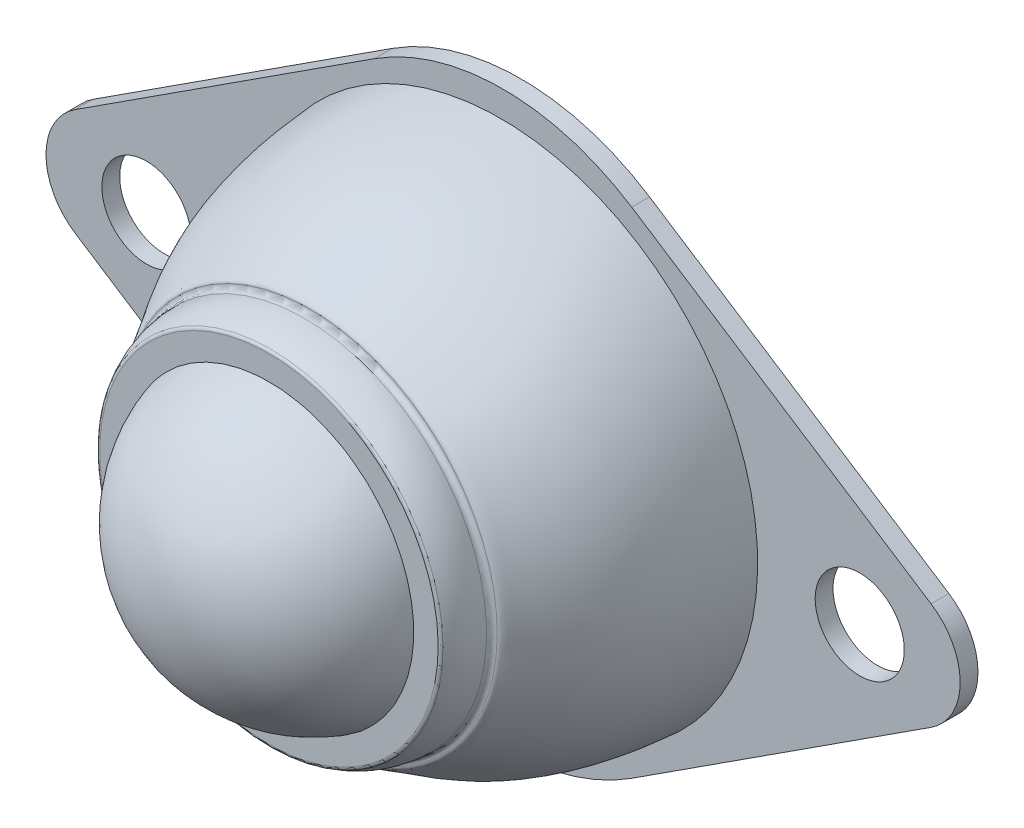
ISO-10303-21;
HEADER;
FILE_DESCRIPTION(('STEP AP214'),'2;1');
FILE_NAME('part.step','',(''),(''),'','','');
FILE_SCHEMA(('AUTOMOTIVE_DESIGN { 1 0 10303 214 1 1 1 1 }'));
ENDSEC;
DATA;
#1=APPLICATION_CONTEXT('core data for automotive mechanical design processes');
#2=APPLICATION_PROTOCOL_DEFINITION('international standard','automotive_design',2000,#1);
#3=PRODUCT_CONTEXT('',#1,'mechanical');
#4=PRODUCT('Part','Part','',(#3));
#5=PRODUCT_RELATED_PRODUCT_CATEGORY('part','',(#4));
#6=PRODUCT_DEFINITION_FORMATION('','',#4);
#7=PRODUCT_DEFINITION_CONTEXT('part definition',#1,'design');
#8=PRODUCT_DEFINITION('design','',#6,#7);
#9=PRODUCT_DEFINITION_SHAPE('','',#8);
#10=(LENGTH_UNIT() NAMED_UNIT(*) SI_UNIT(.MILLI.,.METRE.));
#11=(NAMED_UNIT(*) PLANE_ANGLE_UNIT() SI_UNIT($,.RADIAN.));
#12=(NAMED_UNIT(*) SI_UNIT($,.STERADIAN.) SOLID_ANGLE_UNIT());
#13=UNCERTAINTY_MEASURE_WITH_UNIT(LENGTH_MEASURE(1.E-05),#10,'distance_accuracy_value','');
#14=(GEOMETRIC_REPRESENTATION_CONTEXT(3) GLOBAL_UNCERTAINTY_ASSIGNED_CONTEXT((#13)) GLOBAL_UNIT_ASSIGNED_CONTEXT((#10,
#11,#12)) REPRESENTATION_CONTEXT('',''));
#15=CARTESIAN_POINT('',(0.,0.,0.));
#16=DIRECTION('',(0.,0.,1.));
#17=DIRECTION('',(1.,0.,0.));
#18=AXIS2_PLACEMENT_3D('',#15,#16,#17);
#19=CARTESIAN_POINT('',(15.2377372021562,-7.43146212809468,48.9631578947368));
#20=CARTESIAN_POINT('',(15.2377334064931,-7.43146046419454,60.0776508734915));
#21=CARTESIAN_POINT('',(11.9608409389113,-5.99497316377451,60.077650900424));
#22=CARTESIAN_POINT('',(12.1088145151502,-6.059840157479,62.4631578947368));
#23=CARTESIAN_POINT('',(11.574277558577,-5.82551585257153,62.4631578947368));
#24=B_SPLINE_CURVE_WITH_KNOTS('',4,(#19,#20,#21,#22,#23),.UNSPECIFIED.,.F.,.F.,(5,5),(0.,1.),.UNSPECIFIED.);
#25=CARTESIAN_POINT('',(1.95769599418163,-1.60990687932326,74.9542750035906));
#26=DIRECTION('',(0.,0.,1.));
#27=AXIS1_PLACEMENT('',#25,#26);
#28=SURFACE_OF_REVOLUTION('',#24,#27);
#29=CARTESIAN_POINT('',(1.95769599418163,-1.60990687932326,62.4631578947368));
#30=DIRECTION('',(0.,0.,1.));
#31=DIRECTION('',(-0.915864910894796,0.401486568880788,0.));
#32=AXIS2_PLACEMENT_3D('',#29,#30,#31);
#33=CIRCLE('',#32,10.5);
#34=CARTESIAN_POINT('',(-7.65888557021372,2.60570209392502,62.4631578947368));
#35=VERTEX_POINT('',#34);
#36=EDGE_CURVE('P0_E37',#35,#35,#33,.T.);
#37=ORIENTED_EDGE('',*,*,#36,.F.);
#38=EDGE_LOOP('',(#37));
#39=FACE_BOUND('',#38,.T.);
#40=CARTESIAN_POINT('',(1.95769599418163,-1.60990687932326,51.7631578947369));
#41=DIRECTION('',(0.,0.,1.));
#42=DIRECTION('',(-0.915864910894796,0.401486568880788,0.));
#43=AXIS2_PLACEMENT_3D('',#40,#41,#42);
#44=CIRCLE('',#43,14.4048077186134);
#45=CARTESIAN_POINT('',(-11.2351619434829,4.17342994701034,51.7631578947369));
#46=VERTEX_POINT('',#45);
#47=EDGE_CURVE('P0_E108',#46,#46,#44,.F.);
#48=ORIENTED_EDGE('',*,*,#47,.F.);
#49=EDGE_LOOP('',(#48));
#50=FACE_BOUND('',#49,.T.);
#51=ADVANCED_FACE('P0_F14',(#39,#50),#28,.T.);
#52=CARTESIAN_POINT('',(15.2377372021562,-7.43146212809468,48.9631578947368));
#53=CARTESIAN_POINT('',(15.2377338872716,-7.43146067495281,58.6698312143077));
#54=CARTESIAN_POINT('',(12.7384028720801,-6.335832027267,59.8993291121425));
#55=CARTESIAN_POINT('',(12.2038121606893,-6.10148415792657,61.644060330571));
#56=CARTESIAN_POINT('',(11.8100110798226,-5.92885406488781,62.2675982846212));
#57=B_SPLINE_CURVE_WITH_KNOTS('',4,(#52,#53,#54,#55,#56),.UNSPECIFIED.,.F.,.F.,(5,5),(0.,
0.873334783523202),.UNSPECIFIED.);
#58=CARTESIAN_POINT('',(1.95769599418163,-1.60990687932326,74.9542750035906));
#59=DIRECTION('',(0.,0.,1.));
#60=AXIS1_PLACEMENT('',#58,#59);
#61=SURFACE_OF_REVOLUTION('',#57,#60);
#62=OFFSET_SURFACE('',#61,-1.5,.F.);
#63=CARTESIAN_POINT('',(1.95769599418163,-1.60990687932326,61.1659081283625));
#64=DIRECTION('',(0.,0.,1.));
#65=DIRECTION('',(-0.915864910894796,0.401486568880788,0.));
#66=AXIS2_PLACEMENT_3D('',#63,#64,#65);
#67=CIRCLE('',#66,9.6700643495926);
#68=CARTESIAN_POINT('',(-6.89877662970494,2.27249407725111,61.1659081283625));
#69=VERTEX_POINT('',#68);
#70=EDGE_CURVE('P0_E40',#69,#69,#67,.T.);
#71=ORIENTED_EDGE('',*,*,#70,.T.);
#72=EDGE_LOOP('',(#71));
#73=FACE_BOUND('',#72,.T.);
#74=CARTESIAN_POINT('',(1.95769599418163,-1.60990687932326,51.7631578947368));
#75=DIRECTION('',(0.,0.,1.));
#76=DIRECTION('',(-0.915864910894796,0.401486568880788,0.));
#77=AXIS2_PLACEMENT_3D('',#74,#75,#76);
#78=CIRCLE('',#77,12.9007266368042);
#79=CARTESIAN_POINT('',(-9.85762685751318,3.56956159415626,51.7631578947368));
#80=VERTEX_POINT('',#79);
#81=EDGE_CURVE('P0_E18',#80,#80,#78,.F.);
#82=ORIENTED_EDGE('',*,*,#81,.T.);
#83=EDGE_LOOP('',(#82));
#84=FACE_BOUND('',#83,.T.);
#85=ADVANCED_FACE('P0_F55',(#73,#84),#62,.F.);
#86=CARTESIAN_POINT('',(10.7499991387717,-5.46417794057882,64.7631578947368));
#87=DIRECTION('',(0.,0.,-1.));
#88=DIRECTION('',(0.915864910894796,-0.401486568880788,0.));
#89=AXIS2_PLACEMENT_3D('',#86,#87,#88);
#90=PLANE('',#89);
#91=CARTESIAN_POINT('',(1.95769599418163,-1.60990687932326,64.7631578947368));
#92=DIRECTION('',(0.,0.,-1.));
#93=DIRECTION('',(0.915864910894796,-0.401486568880788,0.));
#94=AXIS2_PLACEMENT_3D('',#91,#92,#93);
#95=CIRCLE('',#94,8.05140383008776);
#96=CARTESIAN_POINT('',(9.33169424560297,-4.84243737773882,64.7631578947368));
#97=VERTEX_POINT('',#96);
#98=EDGE_CURVE('P0_E10',#97,#97,#95,.T.);
#99=ORIENTED_EDGE('',*,*,#98,.T.);
#100=EDGE_LOOP('',(#99));
#101=FACE_BOUND('',#100,.T.);
#102=CARTESIAN_POINT('',(1.95769599418163,-1.60990687932326,64.7631578947368));
#103=DIRECTION('',(0.,0.,-1.));
#104=DIRECTION('',(0.915864910894796,-0.401486568880788,0.));
#105=AXIS2_PLACEMENT_3D('',#102,#103,#104);
#106=CIRCLE('',#105,9.49032495343307);
#107=CARTESIAN_POINT('',(10.6495516120203,-5.42014488244082,64.7631578947368));
#108=VERTEX_POINT('',#107);
#109=EDGE_CURVE('P0_E31',#108,#108,#106,.F.);
#110=ORIENTED_EDGE('',*,*,#109,.T.);
#111=EDGE_LOOP('',(#110));
#112=FACE_BOUND('',#111,.T.);
#113=ADVANCED_FACE('P0_F57',(#101,#112),#90,.F.);
#114=CARTESIAN_POINT('',(1.95769599418163,-1.60990687932326,62.7631578947372));
#115=DIRECTION('',(0.,0.,1.));
#116=DIRECTION('',(-0.915864910894796,0.401486568880788,0.));
#117=AXIS2_PLACEMENT_3D('',#114,#115,#116);
#118=TOROIDAL_SURFACE('',#117,6.56666666666786,3.63333333333214);
#119=CARTESIAN_POINT('',(1.95769599418163,-1.60990687932326,64.6680122636689));
#120=DIRECTION('',(0.,0.,-1.));
#121=DIRECTION('',(0.915864910894796,-0.401486568880788,0.));
#122=AXIS2_PLACEMENT_3D('',#119,#120,#121);
#123=CIRCLE('',#122,9.66063514489517);
#124=CARTESIAN_POINT('',(10.8055327403482,-5.48852213685637,64.6680122636689));
#125=VERTEX_POINT('',#124);
#126=EDGE_CURVE('P0_E26',#125,#125,#123,.T.);
#127=ORIENTED_EDGE('',*,*,#126,.T.);
#128=EDGE_LOOP('',(#127));
#129=FACE_BOUND('',#128,.T.);
#130=CARTESIAN_POINT('',(1.95769599418163,-1.60990687932326,62.7631578947368));
#131=DIRECTION('',(0.,0.,1.));
#132=DIRECTION('',(-0.915864910894796,0.401486568880788,0.));
#133=AXIS2_PLACEMENT_3D('',#130,#131,#132);
#134=CIRCLE('',#133,10.2);
#135=CARTESIAN_POINT('',(-7.38412609694529,2.48525612326078,62.7631578947368));
#136=VERTEX_POINT('',#135);
#137=EDGE_CURVE('P0_E34',#136,#136,#134,.T.);
#138=ORIENTED_EDGE('',*,*,#137,.T.);
#139=EDGE_LOOP('',(#138));
#140=FACE_BOUND('',#139,.T.);
#141=ADVANCED_FACE('P0_F78',(#129,#140),#118,.T.);
#142=CARTESIAN_POINT('',(1.95769599418163,-1.60990687932326,62.7631578947368));
#143=DIRECTION('',(0.,0.,1.));
#144=DIRECTION('',(-0.915864910894796,0.401486568880788,0.));
#145=AXIS2_PLACEMENT_3D('',#142,#143,#144);
#146=TOROIDAL_SURFACE('',#145,10.5,0.300000000000003);
#147=ORIENTED_EDGE('',*,*,#137,.F.);
#148=EDGE_LOOP('',(#147));
#149=FACE_BOUND('',#148,.T.);
#150=ORIENTED_EDGE('',*,*,#36,.T.);
#151=EDGE_LOOP('',(#150));
#152=FACE_BOUND('',#151,.T.);
#153=ADVANCED_FACE('P0_F83',(#149,#152),#146,.F.);
#154=CARTESIAN_POINT('',(1.95769599418163,-1.60990687932326,62.7631578947372));
#155=DIRECTION('',(0.,0.,1.));
#156=DIRECTION('',(-0.915864910894796,0.401486568880788,0.));
#157=AXIS2_PLACEMENT_3D('',#154,#155,#156);
#158=TOROIDAL_SURFACE('',#157,6.56666666666786,2.13333333333214);
#159=CARTESIAN_POINT('',(1.95769599418163,-1.60990687932326,64.4088721804511));
#160=DIRECTION('',(0.,0.,-1.));
#161=DIRECTION('',(0.915864910894796,-0.401486568880788,0.));
#162=AXIS2_PLACEMENT_3D('',#159,#160,#161);
#163=CIRCLE('',#162,7.92414064465171);
#164=CARTESIAN_POINT('',(9.2151383596134,-4.79134291807326,64.4088721804511));
#165=VERTEX_POINT('',#164);
#166=EDGE_CURVE('P0_E22',#165,#165,#163,.F.);
#167=ORIENTED_EDGE('',*,*,#166,.T.);
#168=EDGE_LOOP('',(#167));
#169=FACE_BOUND('',#168,.T.);
#170=CARTESIAN_POINT('',(1.95769599418163,-1.60990687932326,62.763157894737));
#171=DIRECTION('',(0.,0.,1.));
#172=DIRECTION('',(-0.915864910894796,0.401486568880788,0.));
#173=AXIS2_PLACEMENT_3D('',#170,#171,#172);
#174=CIRCLE('',#173,8.7);
#175=CARTESIAN_POINT('',(-6.01032873060309,1.8830262699396,62.763157894737));
#176=VERTEX_POINT('',#175);
#177=EDGE_CURVE('P0_E110',#176,#176,#174,.T.);
#178=ORIENTED_EDGE('',*,*,#177,.F.);
#179=EDGE_LOOP('',(#178));
#180=FACE_BOUND('',#179,.T.);
#181=ADVANCED_FACE('P0_F70',(#169,#180),#158,.F.);
#182=CARTESIAN_POINT('',(1.95769599418163,-1.60990687932326,62.7631578947368));
#183=DIRECTION('',(0.,0.,1.));
#184=DIRECTION('',(-0.915864910894796,0.401486568880788,0.));
#185=AXIS2_PLACEMENT_3D('',#182,#183,#184);
#186=TOROIDAL_SURFACE('',#185,10.5,1.8);
#187=ORIENTED_EDGE('',*,*,#177,.T.);
#188=EDGE_LOOP('',(#187));
#189=FACE_BOUND('',#188,.T.);
#190=ORIENTED_EDGE('',*,*,#70,.F.);
#191=EDGE_LOOP('',(#190));
#192=FACE_BOUND('',#191,.T.);
#193=ADVANCED_FACE('P0_F61',(#189,#192),#186,.T.);
#194=CARTESIAN_POINT('',(1.95769599418163,-1.60990687932326,64.5631578947368));
#195=DIRECTION('',(0.,0.,-1.));
#196=DIRECTION('',(0.915864910894796,-0.401486568880788,0.));
#197=AXIS2_PLACEMENT_3D('',#194,#195,#196);
#198=TOROIDAL_SURFACE('',#197,9.49032495343307,0.2);
#199=ORIENTED_EDGE('',*,*,#126,.F.);
#200=EDGE_LOOP('',(#199));
#201=FACE_BOUND('',#200,.T.);
#202=ORIENTED_EDGE('',*,*,#109,.F.);
#203=EDGE_LOOP('',(#202));
#204=FACE_BOUND('',#203,.T.);
#205=ADVANCED_FACE('P0_F59',(#201,#204),#198,.T.);
#206=CARTESIAN_POINT('',(1.95769599418163,-1.60990687932326,64.5631578947368));
#207=DIRECTION('',(0.,0.,-1.));
#208=DIRECTION('',(0.915864910894796,-0.401486568880788,0.));
#209=AXIS2_PLACEMENT_3D('',#206,#207,#208);
#210=TOROIDAL_SURFACE('',#209,8.05140383008776,0.2);
#211=ORIENTED_EDGE('',*,*,#98,.F.);
#212=EDGE_LOOP('',(#211));
#213=FACE_BOUND('',#212,.T.);
#214=ORIENTED_EDGE('',*,*,#166,.F.);
#215=EDGE_LOOP('',(#214));
#216=FACE_BOUND('',#215,.T.);
#217=ADVANCED_FACE('P0_F16',(#213,#216),#210,.T.);
#218=CARTESIAN_POINT('',(1.95769599418163,-1.60990687932326,51.7631578947368));
#219=DIRECTION('',(0.,0.,-1.));
#220=DIRECTION('',(0.915864910894796,-0.401486568880788,0.));
#221=AXIS2_PLACEMENT_3D('',#218,#219,#220);
#222=PLANE('',#221);
#223=ORIENTED_EDGE('',*,*,#81,.F.);
#224=EDGE_LOOP('',(#223));
#225=FACE_BOUND('',#224,.T.);
#226=ORIENTED_EDGE('',*,*,#47,.T.);
#227=EDGE_LOOP('',(#226));
#228=FACE_BOUND('',#227,.T.);
#229=ADVANCED_FACE('P0_F68',(#225,#228),#222,.T.);
#230=CLOSED_SHELL('',(#51,#85,#113,#141,#153,#181,#193,#205,#217,#229));
#231=MANIFOLD_SOLID_BREP('P0_B1',#230);
#232=CARTESIAN_POINT('',(1.95769599418163,-1.60990687932326,62.2631578947368));
#233=DIRECTION('',(-0.401486568880788,-0.915864910894796,0.));
#234=DIRECTION('',(-0.915864910894796,0.401486568880788,0.));
#235=AXIS2_PLACEMENT_3D('',#232,#233,#234);
#236=SPHERICAL_SURFACE('',#235,8.5);
#237=CARTESIAN_POINT('',(-1.45493984130507,-9.39475862192902,62.2631578947368));
#238=VERTEX_POINT('',#237);
#239=VERTEX_LOOP('',#238);
#240=FACE_BOUND('',#239,.T.);
#241=ADVANCED_FACE('P1_F12',(#240),#236,.T.);
#242=CLOSED_SHELL('',(#241));
#243=MANIFOLD_SOLID_BREP('P1_B1',#242);
#244=CARTESIAN_POINT('',(-19.9720744112589,-1.71023344796259,51.7631578947368));
#245=DIRECTION('',(0.,0.,1.));
#246=DIRECTION('',(1.,0.,0.));
#247=AXIS2_PLACEMENT_3D('',#244,#245,#246);
#248=PLANE('',#247);
#249=CARTESIAN_POINT('',(-17.9143494537037,-1.71023344796259,51.7631578947368));
#250=DIRECTION('',(0.,0.,1.));
#251=DIRECTION('',(1.,0.,0.));
#252=AXIS2_PLACEMENT_3D('',#249,#250,#251);
#253=CIRCLE('',#252,2.5);
#254=CARTESIAN_POINT('',(-15.4143494537037,-1.71023344796259,51.7631578947368));
#255=VERTEX_POINT('',#254);
#256=EDGE_CURVE('P2_E117',#255,#255,#253,.T.);
#257=ORIENTED_EDGE('',*,*,#256,.F.);
#258=EDGE_LOOP('',(#257));
#259=FACE_BOUND('',#258,.T.);
#260=CARTESIAN_POINT('',(-19.9720744112589,-1.71023344796259,51.7631578947368));
#261=DIRECTION('',(0.,0.,1.));
#262=DIRECTION('',(1.,0.,0.));
#263=AXIS2_PLACEMENT_3D('',#260,#261,#262);
#264=CIRCLE('',#263,3.57385398981324);
#265=CARTESIAN_POINT('',(-21.9143494537037,1.28976655203741,51.7631578947368));
#266=VERTEX_POINT('',#265);
#267=CARTESIAN_POINT('',(-21.9143494537037,-4.71023344796259,51.7631578947368));
#268=VERTEX_POINT('',#267);
#269=EDGE_CURVE('P2_E128',#266,#268,#264,.T.);
#270=ORIENTED_EDGE('',*,*,#269,.T.);
#271=DIRECTION('',(0.839429928741093,-0.543467933491687,0.));
#272=VECTOR('',#271,1.);
#273=CARTESIAN_POINT('',(-21.9143494537037,-4.71023344796259,51.7631578947368));
#274=LINE('',#273,#272);
#275=CARTESIAN_POINT('',(-5.12575087888186,-15.5795921177963,51.7631578947368));
#276=VERTEX_POINT('',#275);
#277=EDGE_CURVE('P2_E76',#268,#276,#274,.T.);
#278=ORIENTED_EDGE('',*,*,#277,.T.);
#279=CARTESIAN_POINT('',(2.08565054629629,-4.44100267873182,51.7631578947368));
#280=DIRECTION('',(0.,0.,1.));
#281=DIRECTION('',(1.,0.,0.));
#282=AXIS2_PLACEMENT_3D('',#279,#280,#281);
#283=CIRCLE('',#282,13.2692307692308);
#284=CARTESIAN_POINT('',(9.29705197147444,-15.5795921177963,51.7631578947368));
#285=VERTEX_POINT('',#284);
#286=EDGE_CURVE('P2_E143',#276,#285,#283,.T.);
#287=ORIENTED_EDGE('',*,*,#286,.T.);
#288=DIRECTION('',(0.839429928741093,0.543467933491687,0.));
#289=VECTOR('',#288,1.);
#290=CARTESIAN_POINT('',(26.0856505462963,-4.71023344796259,51.7631578947368));
#291=LINE('',#290,#289);
#292=CARTESIAN_POINT('',(26.0856505462963,-4.71023344796259,51.7631578947368));
#293=VERTEX_POINT('',#292);
#294=EDGE_CURVE('P2_E156',#285,#293,#291,.T.);
#295=ORIENTED_EDGE('',*,*,#294,.T.);
#296=CARTESIAN_POINT('',(24.1433755038515,-1.71023344796259,51.7631578947368));
#297=DIRECTION('',(0.,0.,1.));
#298=DIRECTION('',(-1.,0.,0.));
#299=AXIS2_PLACEMENT_3D('',#296,#297,#298);
#300=CIRCLE('',#299,3.57385398981324);
#301=CARTESIAN_POINT('',(26.0856505462963,1.28976655203741,51.7631578947368));
#302=VERTEX_POINT('',#301);
#303=EDGE_CURVE('P2_E95',#293,#302,#300,.T.);
#304=ORIENTED_EDGE('',*,*,#303,.T.);
#305=DIRECTION('',(-0.839429928741093,0.543467933491686,0.));
#306=VECTOR('',#305,1.);
#307=CARTESIAN_POINT('',(9.29705197147444,12.1591252218711,51.7631578947368));
#308=LINE('',#307,#306);
#309=CARTESIAN_POINT('',(9.29705197147444,12.1591252218711,51.7631578947368));
#310=VERTEX_POINT('',#309);
#311=EDGE_CURVE('P2_E89',#302,#310,#308,.T.);
#312=ORIENTED_EDGE('',*,*,#311,.T.);
#313=CARTESIAN_POINT('',(2.08565054629629,1.02053578280664,51.7631578947368));
#314=DIRECTION('',(0.,0.,1.));
#315=DIRECTION('',(-1.,0.,0.));
#316=AXIS2_PLACEMENT_3D('',#313,#314,#315);
#317=CIRCLE('',#316,13.2692307692308);
#318=CARTESIAN_POINT('',(-5.12575087888185,12.1591252218711,51.7631578947368));
#319=VERTEX_POINT('',#318);
#320=EDGE_CURVE('P2_E93',#310,#319,#317,.T.);
#321=ORIENTED_EDGE('',*,*,#320,.T.);
#322=DIRECTION('',(-0.839429928741093,-0.543467933491686,0.));
#323=VECTOR('',#322,1.);
#324=CARTESIAN_POINT('',(-21.9143494537037,1.28976655203741,51.7631578947368));
#325=LINE('',#324,#323);
#326=EDGE_CURVE('P2_E33',#319,#266,#325,.T.);
#327=ORIENTED_EDGE('',*,*,#326,.T.);
#328=EDGE_LOOP('',(#270,#278,#287,#295,#304,#312,#321,#327));
#329=FACE_BOUND('',#328,.T.);
#330=CARTESIAN_POINT('',(22.0856505462963,-1.71023344796259,51.7631578947368));
#331=DIRECTION('',(0.,0.,1.));
#332=DIRECTION('',(-1.,0.,0.));
#333=AXIS2_PLACEMENT_3D('',#330,#331,#332);
#334=CIRCLE('',#333,2.49999999999999);
#335=CARTESIAN_POINT('',(19.5856505462963,-1.71023344796259,51.7631578947368));
#336=VERTEX_POINT('',#335);
#337=EDGE_CURVE('P2_E165',#336,#336,#334,.T.);
#338=ORIENTED_EDGE('',*,*,#337,.F.);
#339=EDGE_LOOP('',(#338));
#340=FACE_BOUND('',#339,.T.);
#341=ADVANCED_FACE('P2_F16',(#259,#329,#340),#248,.T.);
#342=CARTESIAN_POINT('',(-19.9720744112589,-1.71023344796259,50.7631578947368));
#343=DIRECTION('',(0.,0.,1.));
#344=DIRECTION('',(1.,0.,0.));
#345=AXIS2_PLACEMENT_3D('',#342,#343,#344);
#346=PLANE('',#345);
#347=CARTESIAN_POINT('',(-19.9720744112589,-1.71023344796259,50.7631578947368));
#348=DIRECTION('',(0.,0.,1.));
#349=DIRECTION('',(1.,0.,0.));
#350=AXIS2_PLACEMENT_3D('',#347,#348,#349);
#351=CIRCLE('',#350,3.57385398981324);
#352=CARTESIAN_POINT('',(-21.9143494537037,1.28976655203741,50.7631578947368));
#353=VERTEX_POINT('',#352);
#354=CARTESIAN_POINT('',(-21.9143494537037,-4.71023344796259,50.7631578947368));
#355=VERTEX_POINT('',#354);
#356=EDGE_CURVE('P2_E113',#353,#355,#351,.T.);
#357=ORIENTED_EDGE('',*,*,#356,.F.);
#358=DIRECTION('',(-0.839429928741093,-0.543467933491686,0.));
#359=VECTOR('',#358,1.);
#360=CARTESIAN_POINT('',(-21.9143494537037,1.28976655203741,50.7631578947368));
#361=LINE('',#360,#359);
#362=CARTESIAN_POINT('',(-5.12575087888185,12.1591252218711,50.7631578947368));
#363=VERTEX_POINT('',#362);
#364=EDGE_CURVE('P2_E68',#363,#353,#361,.T.);
#365=ORIENTED_EDGE('',*,*,#364,.F.);
#366=CARTESIAN_POINT('',(2.08565054629629,1.02053578280664,50.7631578947368));
#367=DIRECTION('',(0.,0.,1.));
#368=DIRECTION('',(-1.,0.,0.));
#369=AXIS2_PLACEMENT_3D('',#366,#367,#368);
#370=CIRCLE('',#369,13.2692307692308);
#371=CARTESIAN_POINT('',(9.29705197147444,12.1591252218711,50.7631578947368));
#372=VERTEX_POINT('',#371);
#373=EDGE_CURVE('P2_E62',#372,#363,#370,.T.);
#374=ORIENTED_EDGE('',*,*,#373,.F.);
#375=DIRECTION('',(-0.839429928741093,0.543467933491686,0.));
#376=VECTOR('',#375,1.);
#377=CARTESIAN_POINT('',(9.29705197147444,12.1591252218711,50.7631578947368));
#378=LINE('',#377,#376);
#379=CARTESIAN_POINT('',(26.0856505462963,1.28976655203741,50.7631578947368));
#380=VERTEX_POINT('',#379);
#381=EDGE_CURVE('P2_E103',#380,#372,#378,.T.);
#382=ORIENTED_EDGE('',*,*,#381,.F.);
#383=CARTESIAN_POINT('',(24.1433755038515,-1.71023344796259,50.7631578947368));
#384=DIRECTION('',(0.,0.,1.));
#385=DIRECTION('',(-1.,0.,0.));
#386=AXIS2_PLACEMENT_3D('',#383,#384,#385);
#387=CIRCLE('',#386,3.57385398981324);
#388=CARTESIAN_POINT('',(26.0856505462963,-4.71023344796259,50.7631578947368));
#389=VERTEX_POINT('',#388);
#390=EDGE_CURVE('P2_E123',#389,#380,#387,.T.);
#391=ORIENTED_EDGE('',*,*,#390,.F.);
#392=DIRECTION('',(0.839429928741093,0.543467933491687,0.));
#393=VECTOR('',#392,1.);
#394=CARTESIAN_POINT('',(26.0856505462963,-4.71023344796259,50.7631578947368));
#395=LINE('',#394,#393);
#396=CARTESIAN_POINT('',(9.29705197147444,-15.5795921177963,50.7631578947368));
#397=VERTEX_POINT('',#396);
#398=EDGE_CURVE('P2_E121',#397,#389,#395,.T.);
#399=ORIENTED_EDGE('',*,*,#398,.F.);
#400=CARTESIAN_POINT('',(2.08565054629629,-4.44100267873182,50.7631578947368));
#401=DIRECTION('',(0.,0.,1.));
#402=DIRECTION('',(1.,0.,0.));
#403=AXIS2_PLACEMENT_3D('',#400,#401,#402);
#404=CIRCLE('',#403,13.2692307692308);
#405=CARTESIAN_POINT('',(-5.12575087888186,-15.5795921177963,50.7631578947368));
#406=VERTEX_POINT('',#405);
#407=EDGE_CURVE('P2_E119',#406,#397,#404,.T.);
#408=ORIENTED_EDGE('',*,*,#407,.F.);
#409=DIRECTION('',(0.839429928741093,-0.543467933491687,0.));
#410=VECTOR('',#409,1.);
#411=CARTESIAN_POINT('',(-21.9143494537037,-4.71023344796259,50.7631578947368));
#412=LINE('',#411,#410);
#413=EDGE_CURVE('P2_E116',#355,#406,#412,.T.);
#414=ORIENTED_EDGE('',*,*,#413,.F.);
#415=EDGE_LOOP('',(#357,#365,#374,#382,#391,#399,#408,#414));
#416=FACE_BOUND('',#415,.T.);
#417=CARTESIAN_POINT('',(-17.9143494537037,-1.71023344796259,50.7631578947368));
#418=DIRECTION('',(0.,0.,1.));
#419=DIRECTION('',(1.,0.,0.));
#420=AXIS2_PLACEMENT_3D('',#417,#418,#419);
#421=CIRCLE('',#420,2.5);
#422=CARTESIAN_POINT('',(-15.4143494537037,-1.71023344796259,50.7631578947368));
#423=VERTEX_POINT('',#422);
#424=EDGE_CURVE('P2_E162',#423,#423,#421,.T.);
#425=ORIENTED_EDGE('',*,*,#424,.T.);
#426=EDGE_LOOP('',(#425));
#427=FACE_BOUND('',#426,.T.);
#428=CARTESIAN_POINT('',(22.0856505462963,-1.71023344796259,50.7631578947368));
#429=DIRECTION('',(0.,0.,1.));
#430=DIRECTION('',(-1.,0.,0.));
#431=AXIS2_PLACEMENT_3D('',#428,#429,#430);
#432=CIRCLE('',#431,2.49999999999999);
#433=CARTESIAN_POINT('',(19.5856505462963,-1.71023344796259,50.7631578947368));
#434=VERTEX_POINT('',#433);
#435=EDGE_CURVE('P2_E168',#434,#434,#432,.T.);
#436=ORIENTED_EDGE('',*,*,#435,.T.);
#437=EDGE_LOOP('',(#436));
#438=FACE_BOUND('',#437,.T.);
#439=ADVANCED_FACE('P2_F147',(#416,#427,#438),#346,.F.);
#440=CARTESIAN_POINT('',(-19.9720744112589,-1.71023344796259,51.7631578947368));
#441=DIRECTION('',(0.,0.,-1.));
#442=DIRECTION('',(-1.,0.,0.));
#443=AXIS2_PLACEMENT_3D('',#440,#441,#442);
#444=CYLINDRICAL_SURFACE('',#443,3.57385398981324);
#445=ORIENTED_EDGE('',*,*,#356,.T.);
#446=DIRECTION('',(0.,0.,-1.));
#447=VECTOR('',#446,1.);
#448=CARTESIAN_POINT('',(-21.9143494537037,-4.71023344796259,51.7631578947368));
#449=LINE('',#448,#447);
#450=EDGE_CURVE('P2_E11',#268,#355,#449,.T.);
#451=ORIENTED_EDGE('',*,*,#450,.F.);
#452=ORIENTED_EDGE('',*,*,#269,.F.);
#453=DIRECTION('',(0.,0.,-1.));
#454=VECTOR('',#453,1.);
#455=CARTESIAN_POINT('',(-21.9143494537037,1.28976655203741,51.7631578947368));
#456=LINE('',#455,#454);
#457=EDGE_CURVE('P2_E109',#266,#353,#456,.T.);
#458=ORIENTED_EDGE('',*,*,#457,.T.);
#459=EDGE_LOOP('',(#445,#451,#452,#458));
#460=FACE_BOUND('',#459,.T.);
#461=ADVANCED_FACE('P2_F18',(#460),#444,.T.);
#462=CARTESIAN_POINT('',(-21.9143494537037,-4.71023344796259,51.7631578947368));
#463=DIRECTION('',(0.543467933491687,0.839429928741093,0.));
#464=DIRECTION('',(-0.839429928741093,0.543467933491687,0.));
#465=AXIS2_PLACEMENT_3D('',#462,#463,#464);
#466=PLANE('',#465);
#467=ORIENTED_EDGE('',*,*,#413,.T.);
#468=DIRECTION('',(0.,0.,-1.));
#469=VECTOR('',#468,1.);
#470=CARTESIAN_POINT('',(-5.12575087888186,-15.5795921177963,51.7631578947368));
#471=LINE('',#470,#469);
#472=EDGE_CURVE('P2_E25',#276,#406,#471,.T.);
#473=ORIENTED_EDGE('',*,*,#472,.F.);
#474=ORIENTED_EDGE('',*,*,#277,.F.);
#475=ORIENTED_EDGE('',*,*,#450,.T.);
#476=EDGE_LOOP('',(#467,#473,#474,#475));
#477=FACE_BOUND('',#476,.T.);
#478=ADVANCED_FACE('P2_F201',(#477),#466,.F.);
#479=CARTESIAN_POINT('',(2.08565054629629,-4.44100267873182,51.7631578947368));
#480=DIRECTION('',(0.,0.,-1.));
#481=DIRECTION('',(-1.,0.,0.));
#482=AXIS2_PLACEMENT_3D('',#479,#480,#481);
#483=CYLINDRICAL_SURFACE('',#482,13.2692307692308);
#484=ORIENTED_EDGE('',*,*,#407,.T.);
#485=DIRECTION('',(0.,0.,-1.));
#486=VECTOR('',#485,1.);
#487=CARTESIAN_POINT('',(9.29705197147444,-15.5795921177963,51.7631578947368));
#488=LINE('',#487,#486);
#489=EDGE_CURVE('P2_E135',#285,#397,#488,.T.);
#490=ORIENTED_EDGE('',*,*,#489,.F.);
#491=ORIENTED_EDGE('',*,*,#286,.F.);
#492=ORIENTED_EDGE('',*,*,#472,.T.);
#493=EDGE_LOOP('',(#484,#490,#491,#492));
#494=FACE_BOUND('',#493,.T.);
#495=ADVANCED_FACE('P2_F141',(#494),#483,.T.);
#496=CARTESIAN_POINT('',(26.0856505462963,-4.71023344796259,51.7631578947368));
#497=DIRECTION('',(-0.543467933491687,0.839429928741093,0.));
#498=DIRECTION('',(-0.839429928741093,-0.543467933491687,0.));
#499=AXIS2_PLACEMENT_3D('',#496,#497,#498);
#500=PLANE('',#499);
#501=ORIENTED_EDGE('',*,*,#398,.T.);
#502=DIRECTION('',(0.,0.,-1.));
#503=VECTOR('',#502,1.);
#504=CARTESIAN_POINT('',(26.0856505462963,-4.71023344796259,51.7631578947368));
#505=LINE('',#504,#503);
#506=EDGE_CURVE('P2_E132',#293,#389,#505,.T.);
#507=ORIENTED_EDGE('',*,*,#506,.F.);
#508=ORIENTED_EDGE('',*,*,#294,.F.);
#509=ORIENTED_EDGE('',*,*,#489,.T.);
#510=EDGE_LOOP('',(#501,#507,#508,#509));
#511=FACE_BOUND('',#510,.T.);
#512=ADVANCED_FACE('P2_F152',(#511),#500,.F.);
#513=CARTESIAN_POINT('',(24.1433755038515,-1.71023344796259,51.7631578947368));
#514=DIRECTION('',(0.,0.,-1.));
#515=DIRECTION('',(-1.,0.,0.));
#516=AXIS2_PLACEMENT_3D('',#513,#514,#515);
#517=CYLINDRICAL_SURFACE('',#516,3.57385398981324);
#518=ORIENTED_EDGE('',*,*,#390,.T.);
#519=DIRECTION('',(0.,0.,-1.));
#520=VECTOR('',#519,1.);
#521=CARTESIAN_POINT('',(26.0856505462963,1.28976655203741,51.7631578947368));
#522=LINE('',#521,#520);
#523=EDGE_CURVE('P2_E104',#302,#380,#522,.T.);
#524=ORIENTED_EDGE('',*,*,#523,.F.);
#525=ORIENTED_EDGE('',*,*,#303,.F.);
#526=ORIENTED_EDGE('',*,*,#506,.T.);
#527=EDGE_LOOP('',(#518,#524,#525,#526));
#528=FACE_BOUND('',#527,.T.);
#529=ADVANCED_FACE('P2_F155',(#528),#517,.T.);
#530=CARTESIAN_POINT('',(9.29705197147444,12.1591252218711,51.7631578947368));
#531=DIRECTION('',(-0.543467933491686,-0.839429928741093,0.));
#532=DIRECTION('',(0.839429928741093,-0.543467933491686,0.));
#533=AXIS2_PLACEMENT_3D('',#530,#531,#532);
#534=PLANE('',#533);
#535=ORIENTED_EDGE('',*,*,#381,.T.);
#536=DIRECTION('',(0.,0.,-1.));
#537=VECTOR('',#536,1.);
#538=CARTESIAN_POINT('',(9.29705197147444,12.1591252218711,51.7631578947368));
#539=LINE('',#538,#537);
#540=EDGE_CURVE('P2_E100',#310,#372,#539,.T.);
#541=ORIENTED_EDGE('',*,*,#540,.F.);
#542=ORIENTED_EDGE('',*,*,#311,.F.);
#543=ORIENTED_EDGE('',*,*,#523,.T.);
#544=EDGE_LOOP('',(#535,#541,#542,#543));
#545=FACE_BOUND('',#544,.T.);
#546=ADVANCED_FACE('P2_F101',(#545),#534,.F.);
#547=CARTESIAN_POINT('',(2.08565054629629,1.02053578280664,51.7631578947368));
#548=DIRECTION('',(0.,0.,-1.));
#549=DIRECTION('',(-1.,0.,0.));
#550=AXIS2_PLACEMENT_3D('',#547,#548,#549);
#551=CYLINDRICAL_SURFACE('',#550,13.2692307692308);
#552=ORIENTED_EDGE('',*,*,#373,.T.);
#553=DIRECTION('',(0.,0.,-1.));
#554=VECTOR('',#553,1.);
#555=CARTESIAN_POINT('',(-5.12575087888185,12.1591252218711,51.7631578947368));
#556=LINE('',#555,#554);
#557=EDGE_CURVE('P2_E105',#319,#363,#556,.T.);
#558=ORIENTED_EDGE('',*,*,#557,.F.);
#559=ORIENTED_EDGE('',*,*,#320,.F.);
#560=ORIENTED_EDGE('',*,*,#540,.T.);
#561=EDGE_LOOP('',(#552,#558,#559,#560));
#562=FACE_BOUND('',#561,.T.);
#563=ADVANCED_FACE('P2_F107',(#562),#551,.T.);
#564=CARTESIAN_POINT('',(-21.9143494537037,1.28976655203741,51.7631578947368));
#565=DIRECTION('',(0.543467933491687,-0.839429928741093,0.));
#566=DIRECTION('',(0.839429928741093,0.543467933491687,0.));
#567=AXIS2_PLACEMENT_3D('',#564,#565,#566);
#568=PLANE('',#567);
#569=ORIENTED_EDGE('',*,*,#364,.T.);
#570=ORIENTED_EDGE('',*,*,#457,.F.);
#571=ORIENTED_EDGE('',*,*,#326,.F.);
#572=ORIENTED_EDGE('',*,*,#557,.T.);
#573=EDGE_LOOP('',(#569,#570,#571,#572));
#574=FACE_BOUND('',#573,.T.);
#575=ADVANCED_FACE('P2_F189',(#574),#568,.F.);
#576=CARTESIAN_POINT('',(-17.9143494537037,-1.71023344796259,51.7631578947368));
#577=DIRECTION('',(0.,0.,-1.));
#578=DIRECTION('',(-1.,0.,0.));
#579=AXIS2_PLACEMENT_3D('',#576,#577,#578);
#580=CYLINDRICAL_SURFACE('',#579,2.5);
#581=ORIENTED_EDGE('',*,*,#256,.T.);
#582=EDGE_LOOP('',(#581));
#583=FACE_BOUND('',#582,.T.);
#584=ORIENTED_EDGE('',*,*,#424,.F.);
#585=EDGE_LOOP('',(#584));
#586=FACE_BOUND('',#585,.T.);
#587=ADVANCED_FACE('P2_F186',(#583,#586),#580,.F.);
#588=CARTESIAN_POINT('',(22.0856505462963,-1.71023344796259,51.7631578947368));
#589=DIRECTION('',(0.,0.,-1.));
#590=DIRECTION('',(-1.,0.,0.));
#591=AXIS2_PLACEMENT_3D('',#588,#589,#590);
#592=CYLINDRICAL_SURFACE('',#591,2.49999999999999);
#593=ORIENTED_EDGE('',*,*,#337,.T.);
#594=EDGE_LOOP('',(#593));
#595=FACE_BOUND('',#594,.T.);
#596=ORIENTED_EDGE('',*,*,#435,.F.);
#597=EDGE_LOOP('',(#596));
#598=FACE_BOUND('',#597,.T.);
#599=ADVANCED_FACE('P2_F174',(#595,#598),#592,.F.);
#600=CLOSED_SHELL('',(#341,#439,#461,#478,#495,#512,#529,#546,#563,#575,#587,#599));
#601=MANIFOLD_SOLID_BREP('P2_B1',#600);
#602=ADVANCED_BREP_SHAPE_REPRESENTATION('',(#18,#231,#243,#601),#14);
#603=SHAPE_DEFINITION_REPRESENTATION(#9,#602);
ENDSEC;
END-ISO-10303-21;
